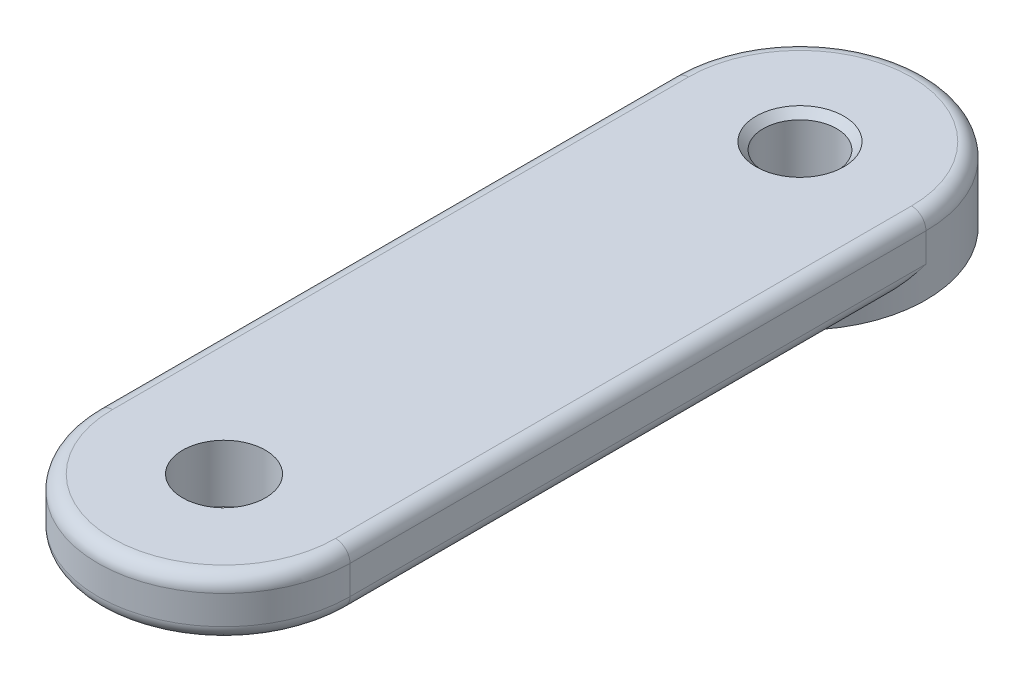
ISO-10303-21;
HEADER;
FILE_DESCRIPTION(('STEP AP214'),'2;1');
FILE_NAME('part.step','',(''),(''),'','','');
FILE_SCHEMA(('AUTOMOTIVE_DESIGN { 1 0 10303 214 1 1 1 1 }'));
ENDSEC;
DATA;
#1=APPLICATION_CONTEXT('core data for automotive mechanical design processes');
#2=APPLICATION_PROTOCOL_DEFINITION('international standard','automotive_design',2000,#1);
#3=PRODUCT_CONTEXT('',#1,'mechanical');
#4=PRODUCT('Part','Part','',(#3));
#5=PRODUCT_RELATED_PRODUCT_CATEGORY('part','',(#4));
#6=PRODUCT_DEFINITION_FORMATION('','',#4);
#7=PRODUCT_DEFINITION_CONTEXT('part definition',#1,'design');
#8=PRODUCT_DEFINITION('design','',#6,#7);
#9=PRODUCT_DEFINITION_SHAPE('','',#8);
#10=(LENGTH_UNIT() NAMED_UNIT(*) SI_UNIT(.MILLI.,.METRE.));
#11=(NAMED_UNIT(*) PLANE_ANGLE_UNIT() SI_UNIT($,.RADIAN.));
#12=(NAMED_UNIT(*) SI_UNIT($,.STERADIAN.) SOLID_ANGLE_UNIT());
#13=UNCERTAINTY_MEASURE_WITH_UNIT(LENGTH_MEASURE(1.E-05),#10,'distance_accuracy_value','');
#14=(GEOMETRIC_REPRESENTATION_CONTEXT(3) GLOBAL_UNCERTAINTY_ASSIGNED_CONTEXT((#13)) GLOBAL_UNIT_ASSIGNED_CONTEXT((#10,
#11,#12)) REPRESENTATION_CONTEXT('',''));
#15=CARTESIAN_POINT('',(0.,0.,0.));
#16=DIRECTION('',(0.,0.,1.));
#17=DIRECTION('',(1.,0.,0.));
#18=AXIS2_PLACEMENT_3D('',#15,#16,#17);
#19=CARTESIAN_POINT('',(0.,4.,-40.));
#20=DIRECTION('',(0.,-1.,0.));
#21=DIRECTION('',(0.,0.,-1.));
#22=AXIS2_PLACEMENT_3D('',#19,#20,#21);
#23=CYLINDRICAL_SURFACE('',#22,8.75);
#24=DIRECTION('',(0.,-1.,0.));
#25=VECTOR('',#24,1.);
#26=CARTESIAN_POINT('',(-8.75,4.,-40.));
#27=LINE('',#26,#25);
#28=CARTESIAN_POINT('',(-8.75,3.,-40.));
#29=VERTEX_POINT('',#28);
#30=CARTESIAN_POINT('',(-8.75,1.,-40.));
#31=VERTEX_POINT('',#30);
#32=EDGE_CURVE('E141',#29,#31,#27,.T.);
#33=ORIENTED_EDGE('',*,*,#32,.F.);
#34=CARTESIAN_POINT('',(0.,3.,-40.));
#35=DIRECTION('',(0.,1.,0.));
#36=DIRECTION('',(0.,0.,1.));
#37=AXIS2_PLACEMENT_3D('',#34,#35,#36);
#38=CIRCLE('',#37,8.75);
#39=CARTESIAN_POINT('',(8.75,3.,-40.));
#40=VERTEX_POINT('',#39);
#41=EDGE_CURVE('E60',#29,#40,#38,.F.);
#42=ORIENTED_EDGE('',*,*,#41,.T.);
#43=DIRECTION('',(0.,-1.,0.));
#44=VECTOR('',#43,1.);
#45=CARTESIAN_POINT('',(8.75,4.,-40.));
#46=LINE('',#45,#44);
#47=CARTESIAN_POINT('',(8.75,1.,-40.));
#48=VERTEX_POINT('',#47);
#49=EDGE_CURVE('E144',#40,#48,#46,.T.);
#50=ORIENTED_EDGE('',*,*,#49,.T.);
#51=CARTESIAN_POINT('',(7.75,0.,-35.937980797682));
#52=CARTESIAN_POINT('',(7.78320596318915,1.19885126429939E-05,-36.0013313121208));
#53=CARTESIAN_POINT('',(7.81562392374817,0.00165330786547828,-36.0650748940763));
#54=CARTESIAN_POINT('',(7.87882330392855,0.00782156762313605,-36.1931987980682));
#55=CARTESIAN_POINT('',(7.90960542264668,0.0123472644338398,-36.2575788339276));
#56=CARTESIAN_POINT('',(7.96943970557268,0.0239000014145327,-36.386748129084));
#57=CARTESIAN_POINT('',(7.99849529642098,0.030921879732447,-36.4515362748852));
#58=CARTESIAN_POINT('',(8.05492752538652,0.0471719881915798,-36.5815694597633));
#59=CARTESIAN_POINT('',(8.08230395638083,0.0564004898329696,-36.646814554103));
#60=CARTESIAN_POINT('',(8.16165958899954,0.0869047008230167,-36.8425374613256));
#61=CARTESIAN_POINT('',(8.21113837320054,0.11105692200864,-36.9735938106531));
#62=CARTESIAN_POINT('',(8.30343318890951,0.165387293356795,-37.2368529984893));
#63=CARTESIAN_POINT('',(8.34624453777672,0.195569644912119,-37.3690565745317));
#64=CARTESIAN_POINT('',(8.44666396818901,0.27827159677768,-37.7061258454143));
#65=CARTESIAN_POINT('',(8.49972857833996,0.334035807313888,-37.9115671008837));
#66=CARTESIAN_POINT('',(8.59050050852229,0.453045624578166,-38.3235863162745));
#67=CARTESIAN_POINT('',(8.62820327399715,0.516293442922013,-38.5301645949342));
#68=CARTESIAN_POINT('',(8.71877674609245,0.713070253727458,-39.1512208783636));
#69=CARTESIAN_POINT('',(8.7491415106011,0.853659548749563,-39.5671187274509));
#70=CARTESIAN_POINT('',(8.74999401234087,0.996005774245474,-39.9881848548499));
#71=CARTESIAN_POINT('',(8.74999999478864,0.998002925361703,-39.9940925060951));
#72=CARTESIAN_POINT('',(8.75,1.,-40.));
#73=B_SPLINE_CURVE_WITH_KNOTS('',3,(#51,#52,#53,#54,#55,#56,#57,#58,#59,#60,#61,#62,#63,#64,#65,
#66,#67,#68,#69,#70,#71,#72),.UNSPECIFIED.,.F.,.F.,(4,2,2,2,2,2,2,2,2,2,4),(0.,
0.214527660428589,0.4289628901577,0.642957244510012,0.856977942020529,1.28306349015566,
1.70944694811933,2.36675300100997,3.0242537937249,4.33894003148971,4.35764832703361),.UNSPECIFIED.);
#74=CARTESIAN_POINT('',(7.75,0.,-35.937980797682));
#75=VERTEX_POINT('',#74);
#76=EDGE_CURVE('E179',#48,#75,#73,.F.);
#77=ORIENTED_EDGE('',*,*,#76,.T.);
#78=CARTESIAN_POINT('',(0.,0.,-40.));
#79=DIRECTION('',(0.,-1.,0.));
#80=DIRECTION('',(0.,0.,-1.));
#81=AXIS2_PLACEMENT_3D('',#78,#79,#80);
#82=CIRCLE('',#81,8.75);
#83=CARTESIAN_POINT('',(-7.75,0.,-35.937980797682));
#84=VERTEX_POINT('',#83);
#85=EDGE_CURVE('E233',#75,#84,#82,.T.);
#86=ORIENTED_EDGE('',*,*,#85,.T.);
#87=CARTESIAN_POINT('',(-7.75,0.,-35.937980797682));
#88=CARTESIAN_POINT('',(-7.78320596318915,1.19885126429889E-05,-36.0013313121208));
#89=CARTESIAN_POINT('',(-7.81562392374817,0.00165330786547828,-36.0650748940763));
#90=CARTESIAN_POINT('',(-7.87882330392855,0.00782156762313608,-36.1931987980682));
#91=CARTESIAN_POINT('',(-7.90960542264668,0.0123472644338399,-36.2575788339276));
#92=CARTESIAN_POINT('',(-7.96943970557268,0.0239000014145327,-36.386748129084));
#93=CARTESIAN_POINT('',(-7.99849529642098,0.0309218797324471,-36.4515362748852));
#94=CARTESIAN_POINT('',(-8.05492752538652,0.0471719881915798,-36.5815694597633));
#95=CARTESIAN_POINT('',(-8.08230395638083,0.0564004898329697,-36.646814554103));
#96=CARTESIAN_POINT('',(-8.16165958899954,0.0869047008230168,-36.8425374613256));
#97=CARTESIAN_POINT('',(-8.21113837320054,0.11105692200864,-36.9735938106531));
#98=CARTESIAN_POINT('',(-8.30343318890951,0.165387293356795,-37.2368529984893));
#99=CARTESIAN_POINT('',(-8.34624453777672,0.195569644912119,-37.3690565745317));
#100=CARTESIAN_POINT('',(-8.44666396818901,0.278271596777681,-37.7061258454143));
#101=CARTESIAN_POINT('',(-8.49972857833996,0.33403580731389,-37.9115671008837));
#102=CARTESIAN_POINT('',(-8.59050050852229,0.453045624578166,-38.3235863162745));
#103=CARTESIAN_POINT('',(-8.62820327399716,0.51629344292201,-38.5301645949342));
#104=CARTESIAN_POINT('',(-8.71877674609245,0.713070253727474,-39.1512208783636));
#105=CARTESIAN_POINT('',(-8.7491415106011,0.85365954874963,-39.5671187274509));
#106=CARTESIAN_POINT('',(-8.74999401234087,0.996005774245475,-39.9881848548499));
#107=CARTESIAN_POINT('',(-8.74999999478864,0.998002925361704,-39.9940925060951));
#108=CARTESIAN_POINT('',(-8.75,1.,-40.));
#109=B_SPLINE_CURVE_WITH_KNOTS('',3,(#87,#88,#89,#90,#91,#92,#93,#94,#95,#96,#97,#98,#99,#100,
#101,#102,#103,#104,#105,#106,#107,#108),.UNSPECIFIED.,.F.,.F.,(4,2,2,2,2,2,2,2,2,2,4),(0.,
0.214527660428589,0.4289628901577,0.642957244510012,0.856977942020529,1.28306349015566,
1.70944694811933,2.36675300100998,3.0242537937249,4.3389400314897,4.35764832703361),.UNSPECIFIED.);
#110=EDGE_CURVE('E171',#84,#31,#109,.T.);
#111=ORIENTED_EDGE('',*,*,#110,.T.);
#112=EDGE_LOOP('',(#33,#42,#50,#77,#86,#111));
#113=FACE_BOUND('',#112,.T.);
#114=CARTESIAN_POINT('',(0.,-1.16,-40.));
#115=DIRECTION('',(0.,-1.,0.));
#116=DIRECTION('',(0.,0.,-1.));
#117=AXIS2_PLACEMENT_3D('',#114,#115,#116);
#118=CIRCLE('',#117,8.75);
#119=CARTESIAN_POINT('',(0.,-1.16,-48.75));
#120=VERTEX_POINT('',#119);
#121=EDGE_CURVE('E228',#120,#120,#118,.T.);
#122=ORIENTED_EDGE('',*,*,#121,.F.);
#123=EDGE_LOOP('',(#122));
#124=FACE_BOUND('',#123,.T.);
#125=ADVANCED_FACE('F36',(#113,#124),#23,.T.);
#126=CARTESIAN_POINT('',(0.,4.,-40.));
#127=DIRECTION('',(0.,-1.,0.));
#128=DIRECTION('',(0.,0.,-1.));
#129=AXIS2_PLACEMENT_3D('',#126,#127,#128);
#130=CYLINDRICAL_SURFACE('',#129,2.55);
#131=CARTESIAN_POINT('',(0.,3.49999999999999,-40.));
#132=DIRECTION('',(0.,1.,0.));
#133=DIRECTION('',(0.,0.,1.));
#134=AXIS2_PLACEMENT_3D('',#131,#132,#133);
#135=CIRCLE('',#134,2.55);
#136=CARTESIAN_POINT('',(0.,3.49999999999999,-37.45));
#137=VERTEX_POINT('',#136);
#138=EDGE_CURVE('E46',#137,#137,#135,.T.);
#139=ORIENTED_EDGE('',*,*,#138,.T.);
#140=EDGE_LOOP('',(#139));
#141=FACE_BOUND('',#140,.T.);
#142=CARTESIAN_POINT('',(0.,-1.16,-40.));
#143=DIRECTION('',(0.,-1.,0.));
#144=DIRECTION('',(0.,0.,-1.));
#145=AXIS2_PLACEMENT_3D('',#142,#143,#144);
#146=CIRCLE('',#145,2.55);
#147=CARTESIAN_POINT('',(0.,-1.16,-42.55));
#148=VERTEX_POINT('',#147);
#149=EDGE_CURVE('E41',#148,#148,#146,.T.);
#150=ORIENTED_EDGE('',*,*,#149,.T.);
#151=EDGE_LOOP('',(#150));
#152=FACE_BOUND('',#151,.T.);
#153=ADVANCED_FACE('F218',(#141,#152),#130,.F.);
#154=CARTESIAN_POINT('',(0.,0.,0.));
#155=DIRECTION('',(0.,1.,0.));
#156=DIRECTION('',(0.,0.,1.));
#157=AXIS2_PLACEMENT_3D('',#154,#155,#156);
#158=PLANE('',#157);
#159=CARTESIAN_POINT('',(0.,0.,0.));
#160=DIRECTION('',(0.,1.,0.));
#161=DIRECTION('',(0.,0.,1.));
#162=AXIS2_PLACEMENT_3D('',#159,#160,#161);
#163=CIRCLE('',#162,2.875);
#164=CARTESIAN_POINT('',(0.,0.,2.875));
#165=VERTEX_POINT('',#164);
#166=EDGE_CURVE('E147',#165,#165,#163,.T.);
#167=ORIENTED_EDGE('',*,*,#166,.T.);
#168=EDGE_LOOP('',(#167));
#169=FACE_BOUND('',#168,.T.);
#170=CARTESIAN_POINT('',(0.,0.,0.));
#171=DIRECTION('',(0.,1.,0.));
#172=DIRECTION('',(0.,0.,1.));
#173=AXIS2_PLACEMENT_3D('',#170,#171,#172);
#174=CIRCLE('',#173,7.75000000000001);
#175=CARTESIAN_POINT('',(7.75000000000001,0.,0.));
#176=VERTEX_POINT('',#175);
#177=CARTESIAN_POINT('',(-7.75000000000001,0.,0.));
#178=VERTEX_POINT('',#177);
#179=EDGE_CURVE('E156',#176,#178,#174,.F.);
#180=ORIENTED_EDGE('',*,*,#179,.T.);
#181=DIRECTION('',(0.,0.,1.));
#182=VECTOR('',#181,1.);
#183=CARTESIAN_POINT('',(-7.75000000000001,0.,0.));
#184=LINE('',#183,#182);
#185=EDGE_CURVE('E136',#178,#84,#184,.F.);
#186=ORIENTED_EDGE('',*,*,#185,.T.);
#187=ORIENTED_EDGE('',*,*,#85,.F.);
#188=DIRECTION('',(0.,0.,-1.));
#189=VECTOR('',#188,1.);
#190=CARTESIAN_POINT('',(7.75000000000001,0.,0.));
#191=LINE('',#190,#189);
#192=EDGE_CURVE('E154',#75,#176,#191,.F.);
#193=ORIENTED_EDGE('',*,*,#192,.T.);
#194=EDGE_LOOP('',(#180,#186,#187,#193));
#195=FACE_BOUND('',#194,.T.);
#196=ADVANCED_FACE('F222',(#169,#195),#158,.F.);
#197=CARTESIAN_POINT('',(0.,4.,0.));
#198=DIRECTION('',(0.,1.,0.));
#199=DIRECTION('',(0.,0.,1.));
#200=AXIS2_PLACEMENT_3D('',#197,#198,#199);
#201=PLANE('',#200);
#202=CARTESIAN_POINT('',(0.,4.,-40.));
#203=DIRECTION('',(0.,1.,0.));
#204=DIRECTION('',(0.,0.,1.));
#205=AXIS2_PLACEMENT_3D('',#202,#203,#204);
#206=CIRCLE('',#205,3.05000000000002);
#207=CARTESIAN_POINT('',(0.,4.,-36.95));
#208=VERTEX_POINT('',#207);
#209=EDGE_CURVE('E11',#208,#208,#206,.F.);
#210=ORIENTED_EDGE('',*,*,#209,.T.);
#211=EDGE_LOOP('',(#210));
#212=FACE_BOUND('',#211,.T.);
#213=DIRECTION('',(0.,0.,1.));
#214=VECTOR('',#213,1.);
#215=CARTESIAN_POINT('',(-7.75000000000001,4.,0.));
#216=LINE('',#215,#214);
#217=CARTESIAN_POINT('',(-7.75,4.,-40.));
#218=VERTEX_POINT('',#217);
#219=CARTESIAN_POINT('',(-7.75000000000001,4.,0.));
#220=VERTEX_POINT('',#219);
#221=EDGE_CURVE('E164',#218,#220,#216,.T.);
#222=ORIENTED_EDGE('',*,*,#221,.T.);
#223=CARTESIAN_POINT('',(0.,4.,0.));
#224=DIRECTION('',(0.,1.,0.));
#225=DIRECTION('',(0.,0.,1.));
#226=AXIS2_PLACEMENT_3D('',#223,#224,#225);
#227=CIRCLE('',#226,7.75000000000001);
#228=CARTESIAN_POINT('',(7.75000000000001,4.,0.));
#229=VERTEX_POINT('',#228);
#230=EDGE_CURVE('E113',#220,#229,#227,.T.);
#231=ORIENTED_EDGE('',*,*,#230,.T.);
#232=DIRECTION('',(0.,0.,-1.));
#233=VECTOR('',#232,1.);
#234=CARTESIAN_POINT('',(7.75,4.,-40.));
#235=LINE('',#234,#233);
#236=CARTESIAN_POINT('',(7.75,4.,-40.));
#237=VERTEX_POINT('',#236);
#238=EDGE_CURVE('E160',#229,#237,#235,.T.);
#239=ORIENTED_EDGE('',*,*,#238,.T.);
#240=CARTESIAN_POINT('',(0.,4.,-40.));
#241=DIRECTION('',(0.,1.,0.));
#242=DIRECTION('',(0.,0.,1.));
#243=AXIS2_PLACEMENT_3D('',#240,#241,#242);
#244=CIRCLE('',#243,7.75);
#245=EDGE_CURVE('E162',#237,#218,#244,.T.);
#246=ORIENTED_EDGE('',*,*,#245,.T.);
#247=EDGE_LOOP('',(#222,#231,#239,#246));
#248=FACE_BOUND('',#247,.T.);
#249=CARTESIAN_POINT('',(0.,4.,0.));
#250=DIRECTION('',(0.,1.,0.));
#251=DIRECTION('',(0.,0.,1.));
#252=AXIS2_PLACEMENT_3D('',#249,#250,#251);
#253=CIRCLE('',#252,2.875);
#254=CARTESIAN_POINT('',(0.,4.,2.875));
#255=VERTEX_POINT('',#254);
#256=EDGE_CURVE('E142',#255,#255,#253,.T.);
#257=ORIENTED_EDGE('',*,*,#256,.F.);
#258=EDGE_LOOP('',(#257));
#259=FACE_BOUND('',#258,.T.);
#260=ADVANCED_FACE('F262',(#212,#248,#259),#201,.T.);
#261=CARTESIAN_POINT('',(0.,4.,0.));
#262=DIRECTION('',(0.,-1.,0.));
#263=DIRECTION('',(0.,0.,-1.));
#264=AXIS2_PLACEMENT_3D('',#261,#262,#263);
#265=CYLINDRICAL_SURFACE('',#264,8.75000000000001);
#266=DIRECTION('',(0.,-1.,0.));
#267=VECTOR('',#266,1.);
#268=CARTESIAN_POINT('',(-8.75000000000001,4.,0.));
#269=LINE('',#268,#267);
#270=CARTESIAN_POINT('',(-8.75000000000001,3.,0.));
#271=VERTEX_POINT('',#270);
#272=CARTESIAN_POINT('',(-8.75000000000001,1.,0.));
#273=VERTEX_POINT('',#272);
#274=EDGE_CURVE('E134',#271,#273,#269,.T.);
#275=ORIENTED_EDGE('',*,*,#274,.T.);
#276=CARTESIAN_POINT('',(0.,1.,0.));
#277=DIRECTION('',(0.,1.,0.));
#278=DIRECTION('',(0.,0.,1.));
#279=AXIS2_PLACEMENT_3D('',#276,#277,#278);
#280=CIRCLE('',#279,8.75000000000001);
#281=CARTESIAN_POINT('',(8.75000000000001,1.,0.));
#282=VERTEX_POINT('',#281);
#283=EDGE_CURVE('E135',#273,#282,#280,.T.);
#284=ORIENTED_EDGE('',*,*,#283,.T.);
#285=DIRECTION('',(0.,-1.,0.));
#286=VECTOR('',#285,1.);
#287=CARTESIAN_POINT('',(8.75000000000001,4.,0.));
#288=LINE('',#287,#286);
#289=CARTESIAN_POINT('',(8.75000000000001,3.,0.));
#290=VERTEX_POINT('',#289);
#291=EDGE_CURVE('E128',#290,#282,#288,.T.);
#292=ORIENTED_EDGE('',*,*,#291,.F.);
#293=CARTESIAN_POINT('',(0.,3.,0.));
#294=DIRECTION('',(0.,1.,0.));
#295=DIRECTION('',(0.,0.,1.));
#296=AXIS2_PLACEMENT_3D('',#293,#294,#295);
#297=CIRCLE('',#296,8.75000000000001);
#298=EDGE_CURVE('E110',#290,#271,#297,.F.);
#299=ORIENTED_EDGE('',*,*,#298,.T.);
#300=EDGE_LOOP('',(#275,#284,#292,#299));
#301=FACE_BOUND('',#300,.T.);
#302=ADVANCED_FACE('F133',(#301),#265,.T.);
#303=CARTESIAN_POINT('',(8.75,4.,-40.));
#304=DIRECTION('',(-1.,0.,0.));
#305=DIRECTION('',(0.,0.,1.));
#306=AXIS2_PLACEMENT_3D('',#303,#304,#305);
#307=PLANE('',#306);
#308=ORIENTED_EDGE('',*,*,#291,.T.);
#309=DIRECTION('',(0.,0.,-1.));
#310=VECTOR('',#309,1.);
#311=CARTESIAN_POINT('',(8.75,1.,-40.));
#312=LINE('',#311,#310);
#313=EDGE_CURVE('E53',#282,#48,#312,.T.);
#314=ORIENTED_EDGE('',*,*,#313,.T.);
#315=ORIENTED_EDGE('',*,*,#49,.F.);
#316=DIRECTION('',(0.,0.,-1.));
#317=VECTOR('',#316,1.);
#318=CARTESIAN_POINT('',(8.75000000000001,3.,0.));
#319=LINE('',#318,#317);
#320=EDGE_CURVE('E168',#40,#290,#319,.F.);
#321=ORIENTED_EDGE('',*,*,#320,.T.);
#322=EDGE_LOOP('',(#308,#314,#315,#321));
#323=FACE_BOUND('',#322,.T.);
#324=ADVANCED_FACE('F257',(#323),#307,.F.);
#325=CARTESIAN_POINT('',(-8.75000000000001,4.,0.));
#326=DIRECTION('',(1.,0.,0.));
#327=DIRECTION('',(0.,0.,-1.));
#328=AXIS2_PLACEMENT_3D('',#325,#326,#327);
#329=PLANE('',#328);
#330=ORIENTED_EDGE('',*,*,#32,.T.);
#331=DIRECTION('',(0.,0.,1.));
#332=VECTOR('',#331,1.);
#333=CARTESIAN_POINT('',(-8.75000000000001,1.,0.));
#334=LINE('',#333,#332);
#335=EDGE_CURVE('E127',#31,#273,#334,.T.);
#336=ORIENTED_EDGE('',*,*,#335,.T.);
#337=ORIENTED_EDGE('',*,*,#274,.F.);
#338=DIRECTION('',(0.,0.,1.));
#339=VECTOR('',#338,1.);
#340=CARTESIAN_POINT('',(-8.75,3.,-40.));
#341=LINE('',#340,#339);
#342=EDGE_CURVE('E120',#271,#29,#341,.F.);
#343=ORIENTED_EDGE('',*,*,#342,.T.);
#344=EDGE_LOOP('',(#330,#336,#337,#343));
#345=FACE_BOUND('',#344,.T.);
#346=ADVANCED_FACE('F139',(#345),#329,.F.);
#347=CARTESIAN_POINT('',(0.,4.,0.));
#348=DIRECTION('',(0.,-1.,0.));
#349=DIRECTION('',(0.,0.,-1.));
#350=AXIS2_PLACEMENT_3D('',#347,#348,#349);
#351=CYLINDRICAL_SURFACE('',#350,2.875);
#352=ORIENTED_EDGE('',*,*,#256,.T.);
#353=EDGE_LOOP('',(#352));
#354=FACE_BOUND('',#353,.T.);
#355=ORIENTED_EDGE('',*,*,#166,.F.);
#356=EDGE_LOOP('',(#355));
#357=FACE_BOUND('',#356,.T.);
#358=ADVANCED_FACE('F203',(#354,#357),#351,.F.);
#359=CARTESIAN_POINT('',(7.75,1.,-40.));
#360=DIRECTION('',(0.,0.,-1.));
#361=DIRECTION('',(-1.,0.,0.));
#362=AXIS2_PLACEMENT_3D('',#359,#360,#361);
#363=CYLINDRICAL_SURFACE('',#362,1.);
#364=ORIENTED_EDGE('',*,*,#76,.F.);
#365=ORIENTED_EDGE('',*,*,#313,.F.);
#366=CARTESIAN_POINT('',(7.75000000000001,1.,0.));
#367=DIRECTION('',(0.,0.,1.));
#368=DIRECTION('',(1.,0.,0.));
#369=AXIS2_PLACEMENT_3D('',#366,#367,#368);
#370=CIRCLE('',#369,1.);
#371=EDGE_CURVE('E235',#176,#282,#370,.T.);
#372=ORIENTED_EDGE('',*,*,#371,.F.);
#373=ORIENTED_EDGE('',*,*,#192,.F.);
#374=EDGE_LOOP('',(#364,#365,#372,#373));
#375=FACE_BOUND('',#374,.T.);
#376=ADVANCED_FACE('F198',(#375),#363,.T.);
#377=CARTESIAN_POINT('',(0.,1.,0.));
#378=DIRECTION('',(0.,1.,0.));
#379=DIRECTION('',(0.,0.,1.));
#380=AXIS2_PLACEMENT_3D('',#377,#378,#379);
#381=TOROIDAL_SURFACE('',#380,7.75000000000001,1.);
#382=ORIENTED_EDGE('',*,*,#371,.T.);
#383=ORIENTED_EDGE('',*,*,#283,.F.);
#384=CARTESIAN_POINT('',(-7.75000000000001,1.,0.));
#385=DIRECTION('',(0.,0.,-1.));
#386=DIRECTION('',(-1.,0.,0.));
#387=AXIS2_PLACEMENT_3D('',#384,#385,#386);
#388=CIRCLE('',#387,1.);
#389=EDGE_CURVE('E240',#178,#273,#388,.T.);
#390=ORIENTED_EDGE('',*,*,#389,.F.);
#391=ORIENTED_EDGE('',*,*,#179,.F.);
#392=EDGE_LOOP('',(#382,#383,#390,#391));
#393=FACE_BOUND('',#392,.T.);
#394=ADVANCED_FACE('F195',(#393),#381,.T.);
#395=CARTESIAN_POINT('',(-7.75000000000001,1.,0.));
#396=DIRECTION('',(0.,0.,1.));
#397=DIRECTION('',(1.,0.,0.));
#398=AXIS2_PLACEMENT_3D('',#395,#396,#397);
#399=CYLINDRICAL_SURFACE('',#398,1.);
#400=ORIENTED_EDGE('',*,*,#110,.F.);
#401=ORIENTED_EDGE('',*,*,#185,.F.);
#402=ORIENTED_EDGE('',*,*,#389,.T.);
#403=ORIENTED_EDGE('',*,*,#335,.F.);
#404=EDGE_LOOP('',(#400,#401,#402,#403));
#405=FACE_BOUND('',#404,.T.);
#406=ADVANCED_FACE('F189',(#405),#399,.T.);
#407=CARTESIAN_POINT('',(0.,3.,-40.));
#408=DIRECTION('',(0.,1.,0.));
#409=DIRECTION('',(0.,0.,1.));
#410=AXIS2_PLACEMENT_3D('',#407,#408,#409);
#411=TOROIDAL_SURFACE('',#410,7.75,1.);
#412=CARTESIAN_POINT('',(7.75,3.,-40.));
#413=DIRECTION('',(0.,0.,1.));
#414=DIRECTION('',(1.,0.,0.));
#415=AXIS2_PLACEMENT_3D('',#412,#413,#414);
#416=CIRCLE('',#415,1.);
#417=EDGE_CURVE('E116',#40,#237,#416,.T.);
#418=ORIENTED_EDGE('',*,*,#417,.F.);
#419=ORIENTED_EDGE('',*,*,#41,.F.);
#420=CARTESIAN_POINT('',(-7.75,3.,-40.));
#421=DIRECTION('',(0.,0.,1.));
#422=DIRECTION('',(1.,0.,0.));
#423=AXIS2_PLACEMENT_3D('',#420,#421,#422);
#424=CIRCLE('',#423,1.);
#425=EDGE_CURVE('E123',#218,#29,#424,.T.);
#426=ORIENTED_EDGE('',*,*,#425,.F.);
#427=ORIENTED_EDGE('',*,*,#245,.F.);
#428=EDGE_LOOP('',(#418,#419,#426,#427));
#429=FACE_BOUND('',#428,.T.);
#430=ADVANCED_FACE('F194',(#429),#411,.T.);
#431=CARTESIAN_POINT('',(-7.75000000000001,3.,0.));
#432=DIRECTION('',(0.,0.,-1.));
#433=DIRECTION('',(-1.,0.,0.));
#434=AXIS2_PLACEMENT_3D('',#431,#432,#433);
#435=CYLINDRICAL_SURFACE('',#434,1.);
#436=ORIENTED_EDGE('',*,*,#425,.T.);
#437=ORIENTED_EDGE('',*,*,#342,.F.);
#438=CARTESIAN_POINT('',(-7.75000000000001,3.,0.));
#439=DIRECTION('',(0.,0.,1.));
#440=DIRECTION('',(1.,0.,0.));
#441=AXIS2_PLACEMENT_3D('',#438,#439,#440);
#442=CIRCLE('',#441,1.);
#443=EDGE_CURVE('E106',#220,#271,#442,.T.);
#444=ORIENTED_EDGE('',*,*,#443,.F.);
#445=ORIENTED_EDGE('',*,*,#221,.F.);
#446=EDGE_LOOP('',(#436,#437,#444,#445));
#447=FACE_BOUND('',#446,.T.);
#448=ADVANCED_FACE('F121',(#447),#435,.T.);
#449=CARTESIAN_POINT('',(7.75000000000001,3.,0.));
#450=DIRECTION('',(0.,0.,1.));
#451=DIRECTION('',(1.,0.,0.));
#452=AXIS2_PLACEMENT_3D('',#449,#450,#451);
#453=CYLINDRICAL_SURFACE('',#452,1.);
#454=ORIENTED_EDGE('',*,*,#417,.T.);
#455=ORIENTED_EDGE('',*,*,#238,.F.);
#456=CARTESIAN_POINT('',(7.75000000000001,3.,0.));
#457=DIRECTION('',(0.,0.,1.));
#458=DIRECTION('',(1.,0.,0.));
#459=AXIS2_PLACEMENT_3D('',#456,#457,#458);
#460=CIRCLE('',#459,1.);
#461=EDGE_CURVE('E117',#290,#229,#460,.T.);
#462=ORIENTED_EDGE('',*,*,#461,.F.);
#463=ORIENTED_EDGE('',*,*,#320,.F.);
#464=EDGE_LOOP('',(#454,#455,#462,#463));
#465=FACE_BOUND('',#464,.T.);
#466=ADVANCED_FACE('F207',(#465),#453,.T.);
#467=CARTESIAN_POINT('',(0.,3.,0.));
#468=DIRECTION('',(0.,1.,0.));
#469=DIRECTION('',(0.,0.,1.));
#470=AXIS2_PLACEMENT_3D('',#467,#468,#469);
#471=TOROIDAL_SURFACE('',#470,7.75000000000001,1.);
#472=ORIENTED_EDGE('',*,*,#443,.T.);
#473=ORIENTED_EDGE('',*,*,#298,.F.);
#474=ORIENTED_EDGE('',*,*,#461,.T.);
#475=ORIENTED_EDGE('',*,*,#230,.F.);
#476=EDGE_LOOP('',(#472,#473,#474,#475));
#477=FACE_BOUND('',#476,.T.);
#478=ADVANCED_FACE('F108',(#477),#471,.T.);
#479=CARTESIAN_POINT('',(0.,3.49999999999999,-40.));
#480=DIRECTION('',(0.,1.,0.));
#481=DIRECTION('',(0.,0.,1.));
#482=AXIS2_PLACEMENT_3D('',#479,#480,#481);
#483=CONICAL_SURFACE('',#482,2.55,0.785398163397453);
#484=ORIENTED_EDGE('',*,*,#209,.F.);
#485=EDGE_LOOP('',(#484));
#486=FACE_BOUND('',#485,.T.);
#487=ORIENTED_EDGE('',*,*,#138,.F.);
#488=EDGE_LOOP('',(#487));
#489=FACE_BOUND('',#488,.T.);
#490=ADVANCED_FACE('F39',(#486,#489),#483,.F.);
#491=CARTESIAN_POINT('',(0.,-1.16,-40.));
#492=DIRECTION('',(0.,-1.,0.));
#493=DIRECTION('',(0.,0.,-1.));
#494=AXIS2_PLACEMENT_3D('',#491,#492,#493);
#495=PLANE('',#494);
#496=ORIENTED_EDGE('',*,*,#149,.F.);
#497=EDGE_LOOP('',(#496));
#498=FACE_BOUND('',#497,.T.);
#499=ORIENTED_EDGE('',*,*,#121,.T.);
#500=EDGE_LOOP('',(#499));
#501=FACE_BOUND('',#500,.T.);
#502=ADVANCED_FACE('F303',(#498,#501),#495,.T.);
#503=CLOSED_SHELL('',(#125,#153,#196,#260,#302,#324,#346,#358,#376,#394,#406,#430,#448,#466,
#478,#490,#502));
#504=MANIFOLD_SOLID_BREP('B2',#503);
#505=ADVANCED_BREP_SHAPE_REPRESENTATION('',(#18,#504),#14);
#506=SHAPE_DEFINITION_REPRESENTATION(#9,#505);
ENDSEC;
END-ISO-10303-21;
